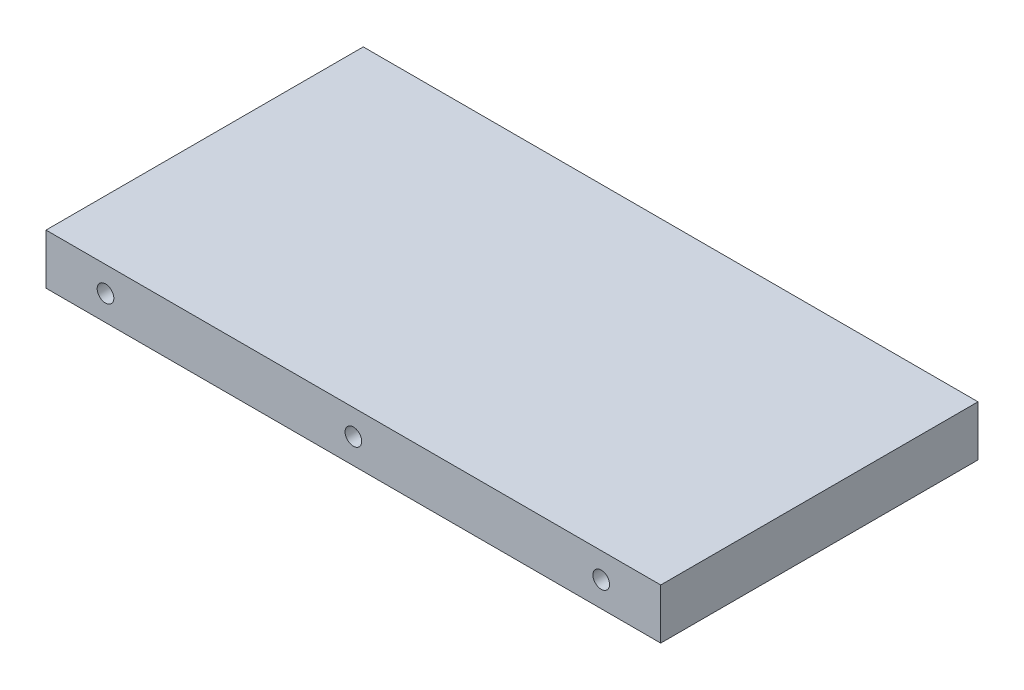
ISO-10303-21;
HEADER;
FILE_DESCRIPTION(('STEP AP214'),'2;1');
FILE_NAME('part.step','',(''),(''),'','','');
FILE_SCHEMA(('AUTOMOTIVE_DESIGN { 1 0 10303 214 1 1 1 1 }'));
ENDSEC;
DATA;
#1=APPLICATION_CONTEXT('core data for automotive mechanical design processes');
#2=APPLICATION_PROTOCOL_DEFINITION('international standard','automotive_design',2000,#1);
#3=PRODUCT_CONTEXT('',#1,'mechanical');
#4=PRODUCT('Part','Part','',(#3));
#5=PRODUCT_RELATED_PRODUCT_CATEGORY('part','',(#4));
#6=PRODUCT_DEFINITION_FORMATION('','',#4);
#7=PRODUCT_DEFINITION_CONTEXT('part definition',#1,'design');
#8=PRODUCT_DEFINITION('design','',#6,#7);
#9=PRODUCT_DEFINITION_SHAPE('','',#8);
#10=(LENGTH_UNIT() NAMED_UNIT(*) SI_UNIT(.MILLI.,.METRE.));
#11=(NAMED_UNIT(*) PLANE_ANGLE_UNIT() SI_UNIT($,.RADIAN.));
#12=(NAMED_UNIT(*) SI_UNIT($,.STERADIAN.) SOLID_ANGLE_UNIT());
#13=UNCERTAINTY_MEASURE_WITH_UNIT(LENGTH_MEASURE(1.E-05),#10,'distance_accuracy_value','');
#14=(GEOMETRIC_REPRESENTATION_CONTEXT(3) GLOBAL_UNCERTAINTY_ASSIGNED_CONTEXT((#13)) GLOBAL_UNIT_ASSIGNED_CONTEXT((#10,
#11,#12)) REPRESENTATION_CONTEXT('',''));
#15=CARTESIAN_POINT('',(0.,0.,0.));
#16=DIRECTION('',(0.,0.,1.));
#17=DIRECTION('',(1.,0.,0.));
#18=AXIS2_PLACEMENT_3D('',#15,#16,#17);
#19=CARTESIAN_POINT('',(-77.5,12.7,40.));
#20=DIRECTION('',(1.,0.,0.));
#21=DIRECTION('',(0.,0.,-1.));
#22=AXIS2_PLACEMENT_3D('',#19,#20,#21);
#23=PLANE('',#22);
#24=DIRECTION('',(0.,0.,1.));
#25=VECTOR('',#24,1.);
#26=CARTESIAN_POINT('',(-77.5,0.,40.));
#27=LINE('',#26,#25);
#28=CARTESIAN_POINT('',(-77.5,0.,-40.));
#29=VERTEX_POINT('',#28);
#30=CARTESIAN_POINT('',(-77.5,0.,40.));
#31=VERTEX_POINT('',#30);
#32=EDGE_CURVE('E97',#29,#31,#27,.T.);
#33=ORIENTED_EDGE('',*,*,#32,.T.);
#34=DIRECTION('',(0.,-1.,0.));
#35=VECTOR('',#34,1.);
#36=CARTESIAN_POINT('',(-77.5,12.7,40.));
#37=LINE('',#36,#35);
#38=CARTESIAN_POINT('',(-77.5,12.7,40.));
#39=VERTEX_POINT('',#38);
#40=EDGE_CURVE('E11',#39,#31,#37,.T.);
#41=ORIENTED_EDGE('',*,*,#40,.F.);
#42=DIRECTION('',(0.,0.,1.));
#43=VECTOR('',#42,1.);
#44=CARTESIAN_POINT('',(-77.5,12.7,40.));
#45=LINE('',#44,#43);
#46=CARTESIAN_POINT('',(-77.5,12.7,-40.));
#47=VERTEX_POINT('',#46);
#48=EDGE_CURVE('E85',#47,#39,#45,.T.);
#49=ORIENTED_EDGE('',*,*,#48,.F.);
#50=DIRECTION('',(0.,-1.,0.));
#51=VECTOR('',#50,1.);
#52=CARTESIAN_POINT('',(-77.5,12.7,-40.));
#53=LINE('',#52,#51);
#54=EDGE_CURVE('E93',#47,#29,#53,.T.);
#55=ORIENTED_EDGE('',*,*,#54,.T.);
#56=EDGE_LOOP('',(#33,#41,#49,#55));
#57=FACE_BOUND('',#56,.T.);
#58=ADVANCED_FACE('F34',(#57),#23,.F.);
#59=CARTESIAN_POINT('',(77.5,12.7,40.));
#60=DIRECTION('',(0.,0.,-1.));
#61=DIRECTION('',(-1.,0.,0.));
#62=AXIS2_PLACEMENT_3D('',#59,#60,#61);
#63=PLANE('',#62);
#64=CARTESIAN_POINT('',(-62.5,6.35,40.));
#65=DIRECTION('',(0.,0.,1.));
#66=DIRECTION('',(1.,0.,0.));
#67=AXIS2_PLACEMENT_3D('',#64,#65,#66);
#68=CIRCLE('',#67,2.1);
#69=CARTESIAN_POINT('',(-60.4,6.35,40.));
#70=VERTEX_POINT('',#69);
#71=EDGE_CURVE('E125',#70,#70,#68,.T.);
#72=ORIENTED_EDGE('',*,*,#71,.F.);
#73=EDGE_LOOP('',(#72));
#74=FACE_BOUND('',#73,.T.);
#75=CARTESIAN_POINT('',(0.,6.35,40.));
#76=DIRECTION('',(0.,0.,1.));
#77=DIRECTION('',(1.,0.,0.));
#78=AXIS2_PLACEMENT_3D('',#75,#76,#77);
#79=CIRCLE('',#78,2.1);
#80=CARTESIAN_POINT('',(2.1,6.35,40.));
#81=VERTEX_POINT('',#80);
#82=EDGE_CURVE('E119',#81,#81,#79,.T.);
#83=ORIENTED_EDGE('',*,*,#82,.F.);
#84=EDGE_LOOP('',(#83));
#85=FACE_BOUND('',#84,.T.);
#86=CARTESIAN_POINT('',(62.5,6.35000000000002,40.));
#87=DIRECTION('',(0.,0.,1.));
#88=DIRECTION('',(1.,0.,0.));
#89=AXIS2_PLACEMENT_3D('',#86,#87,#88);
#90=CIRCLE('',#89,2.1);
#91=CARTESIAN_POINT('',(64.6,6.35000000000002,40.));
#92=VERTEX_POINT('',#91);
#93=EDGE_CURVE('E113',#92,#92,#90,.T.);
#94=ORIENTED_EDGE('',*,*,#93,.F.);
#95=EDGE_LOOP('',(#94));
#96=FACE_BOUND('',#95,.T.);
#97=DIRECTION('',(1.,0.,0.));
#98=VECTOR('',#97,1.);
#99=CARTESIAN_POINT('',(77.5,0.,40.));
#100=LINE('',#99,#98);
#101=CARTESIAN_POINT('',(77.5,0.,40.));
#102=VERTEX_POINT('',#101);
#103=EDGE_CURVE('E89',#31,#102,#100,.T.);
#104=ORIENTED_EDGE('',*,*,#103,.T.);
#105=DIRECTION('',(0.,-1.,0.));
#106=VECTOR('',#105,1.);
#107=CARTESIAN_POINT('',(77.5,12.7,40.));
#108=LINE('',#107,#106);
#109=CARTESIAN_POINT('',(77.5,12.7,40.));
#110=VERTEX_POINT('',#109);
#111=EDGE_CURVE('E42',#110,#102,#108,.T.);
#112=ORIENTED_EDGE('',*,*,#111,.F.);
#113=DIRECTION('',(1.,0.,0.));
#114=VECTOR('',#113,1.);
#115=CARTESIAN_POINT('',(77.5,12.7,40.));
#116=LINE('',#115,#114);
#117=EDGE_CURVE('E80',#39,#110,#116,.T.);
#118=ORIENTED_EDGE('',*,*,#117,.F.);
#119=ORIENTED_EDGE('',*,*,#40,.T.);
#120=EDGE_LOOP('',(#104,#112,#118,#119));
#121=FACE_BOUND('',#120,.T.);
#122=ADVANCED_FACE('F88',(#74,#85,#96,#121),#63,.F.);
#123=CARTESIAN_POINT('',(77.5,12.7,40.));
#124=DIRECTION('',(-1.,0.,0.));
#125=DIRECTION('',(0.,0.,1.));
#126=AXIS2_PLACEMENT_3D('',#123,#124,#125);
#127=PLANE('',#126);
#128=DIRECTION('',(0.,0.,-1.));
#129=VECTOR('',#128,1.);
#130=CARTESIAN_POINT('',(77.5,0.,40.));
#131=LINE('',#130,#129);
#132=CARTESIAN_POINT('',(77.5,0.,-40.));
#133=VERTEX_POINT('',#132);
#134=EDGE_CURVE('E67',#102,#133,#131,.T.);
#135=ORIENTED_EDGE('',*,*,#134,.T.);
#136=DIRECTION('',(0.,-1.,0.));
#137=VECTOR('',#136,1.);
#138=CARTESIAN_POINT('',(77.5,12.7,-40.));
#139=LINE('',#138,#137);
#140=CARTESIAN_POINT('',(77.5,12.7,-40.));
#141=VERTEX_POINT('',#140);
#142=EDGE_CURVE('E90',#141,#133,#139,.T.);
#143=ORIENTED_EDGE('',*,*,#142,.F.);
#144=DIRECTION('',(0.,0.,-1.));
#145=VECTOR('',#144,1.);
#146=CARTESIAN_POINT('',(77.5,12.7,40.));
#147=LINE('',#146,#145);
#148=EDGE_CURVE('E83',#110,#141,#147,.T.);
#149=ORIENTED_EDGE('',*,*,#148,.F.);
#150=ORIENTED_EDGE('',*,*,#111,.T.);
#151=EDGE_LOOP('',(#135,#143,#149,#150));
#152=FACE_BOUND('',#151,.T.);
#153=ADVANCED_FACE('F91',(#152),#127,.F.);
#154=CARTESIAN_POINT('',(77.5,12.7,-40.));
#155=DIRECTION('',(0.,0.,1.));
#156=DIRECTION('',(1.,0.,0.));
#157=AXIS2_PLACEMENT_3D('',#154,#155,#156);
#158=PLANE('',#157);
#159=CARTESIAN_POINT('',(-62.5,6.35,-40.));
#160=DIRECTION('',(0.,0.,1.));
#161=DIRECTION('',(1.,0.,0.));
#162=AXIS2_PLACEMENT_3D('',#159,#160,#161);
#163=CIRCLE('',#162,2.09999999999999);
#164=CARTESIAN_POINT('',(-60.4,6.35,-40.));
#165=VERTEX_POINT('',#164);
#166=EDGE_CURVE('E122',#165,#165,#163,.T.);
#167=ORIENTED_EDGE('',*,*,#166,.T.);
#168=EDGE_LOOP('',(#167));
#169=FACE_BOUND('',#168,.T.);
#170=CARTESIAN_POINT('',(0.,6.35,-40.));
#171=DIRECTION('',(0.,0.,1.));
#172=DIRECTION('',(1.,0.,0.));
#173=AXIS2_PLACEMENT_3D('',#170,#171,#172);
#174=CIRCLE('',#173,2.09999999999999);
#175=CARTESIAN_POINT('',(2.09999999999999,6.35,-40.));
#176=VERTEX_POINT('',#175);
#177=EDGE_CURVE('E116',#176,#176,#174,.T.);
#178=ORIENTED_EDGE('',*,*,#177,.T.);
#179=EDGE_LOOP('',(#178));
#180=FACE_BOUND('',#179,.T.);
#181=CARTESIAN_POINT('',(62.5,6.35000000000002,-40.));
#182=DIRECTION('',(0.,0.,1.));
#183=DIRECTION('',(1.,0.,0.));
#184=AXIS2_PLACEMENT_3D('',#181,#182,#183);
#185=CIRCLE('',#184,2.09999999999999);
#186=CARTESIAN_POINT('',(64.6,6.35000000000002,-40.));
#187=VERTEX_POINT('',#186);
#188=EDGE_CURVE('E100',#187,#187,#185,.T.);
#189=ORIENTED_EDGE('',*,*,#188,.T.);
#190=EDGE_LOOP('',(#189));
#191=FACE_BOUND('',#190,.T.);
#192=DIRECTION('',(-1.,0.,0.));
#193=VECTOR('',#192,1.);
#194=CARTESIAN_POINT('',(77.5,0.,-40.));
#195=LINE('',#194,#193);
#196=EDGE_CURVE('E73',#133,#29,#195,.T.);
#197=ORIENTED_EDGE('',*,*,#196,.T.);
#198=ORIENTED_EDGE('',*,*,#54,.F.);
#199=DIRECTION('',(-1.,0.,0.));
#200=VECTOR('',#199,1.);
#201=CARTESIAN_POINT('',(77.5,12.7,-40.));
#202=LINE('',#201,#200);
#203=EDGE_CURVE('E50',#141,#47,#202,.T.);
#204=ORIENTED_EDGE('',*,*,#203,.F.);
#205=ORIENTED_EDGE('',*,*,#142,.T.);
#206=EDGE_LOOP('',(#197,#198,#204,#205));
#207=FACE_BOUND('',#206,.T.);
#208=ADVANCED_FACE('F105',(#169,#180,#191,#207),#158,.F.);
#209=CARTESIAN_POINT('',(0.,12.7,0.));
#210=DIRECTION('',(0.,1.,0.));
#211=DIRECTION('',(0.,0.,1.));
#212=AXIS2_PLACEMENT_3D('',#209,#210,#211);
#213=PLANE('',#212);
#214=ORIENTED_EDGE('',*,*,#48,.T.);
#215=ORIENTED_EDGE('',*,*,#117,.T.);
#216=ORIENTED_EDGE('',*,*,#148,.T.);
#217=ORIENTED_EDGE('',*,*,#203,.T.);
#218=EDGE_LOOP('',(#214,#215,#216,#217));
#219=FACE_BOUND('',#218,.T.);
#220=ADVANCED_FACE('F81',(#219),#213,.T.);
#221=CARTESIAN_POINT('',(0.,0.,0.));
#222=DIRECTION('',(0.,1.,0.));
#223=DIRECTION('',(0.,0.,1.));
#224=AXIS2_PLACEMENT_3D('',#221,#222,#223);
#225=PLANE('',#224);
#226=ORIENTED_EDGE('',*,*,#32,.F.);
#227=ORIENTED_EDGE('',*,*,#196,.F.);
#228=ORIENTED_EDGE('',*,*,#134,.F.);
#229=ORIENTED_EDGE('',*,*,#103,.F.);
#230=EDGE_LOOP('',(#226,#227,#228,#229));
#231=FACE_BOUND('',#230,.T.);
#232=ADVANCED_FACE('F108',(#231),#225,.F.);
#233=CARTESIAN_POINT('',(62.5,6.35000000000002,40.));
#234=DIRECTION('',(0.,0.,1.));
#235=DIRECTION('',(1.,0.,0.));
#236=AXIS2_PLACEMENT_3D('',#233,#234,#235);
#237=CYLINDRICAL_SURFACE('',#236,2.1);
#238=ORIENTED_EDGE('',*,*,#188,.F.);
#239=EDGE_LOOP('',(#238));
#240=FACE_BOUND('',#239,.T.);
#241=ORIENTED_EDGE('',*,*,#93,.T.);
#242=EDGE_LOOP('',(#241));
#243=FACE_BOUND('',#242,.T.);
#244=ADVANCED_FACE('F137',(#240,#243),#237,.F.);
#245=CARTESIAN_POINT('',(0.,6.35,40.));
#246=DIRECTION('',(0.,0.,1.));
#247=DIRECTION('',(1.,0.,0.));
#248=AXIS2_PLACEMENT_3D('',#245,#246,#247);
#249=CYLINDRICAL_SURFACE('',#248,2.09999999999999);
#250=ORIENTED_EDGE('',*,*,#177,.F.);
#251=EDGE_LOOP('',(#250));
#252=FACE_BOUND('',#251,.T.);
#253=ORIENTED_EDGE('',*,*,#82,.T.);
#254=EDGE_LOOP('',(#253));
#255=FACE_BOUND('',#254,.T.);
#256=ADVANCED_FACE('F139',(#252,#255),#249,.F.);
#257=CARTESIAN_POINT('',(-62.5,6.35,40.));
#258=DIRECTION('',(0.,0.,1.));
#259=DIRECTION('',(1.,0.,0.));
#260=AXIS2_PLACEMENT_3D('',#257,#258,#259);
#261=CYLINDRICAL_SURFACE('',#260,2.09999999999999);
#262=ORIENTED_EDGE('',*,*,#166,.F.);
#263=EDGE_LOOP('',(#262));
#264=FACE_BOUND('',#263,.T.);
#265=ORIENTED_EDGE('',*,*,#71,.T.);
#266=EDGE_LOOP('',(#265));
#267=FACE_BOUND('',#266,.T.);
#268=ADVANCED_FACE('F129',(#264,#267),#261,.F.);
#269=CLOSED_SHELL('',(#58,#122,#153,#208,#220,#232,#244,#256,#268));
#270=MANIFOLD_SOLID_BREP('B2',#269);
#271=ADVANCED_BREP_SHAPE_REPRESENTATION('',(#18,#270),#14);
#272=SHAPE_DEFINITION_REPRESENTATION(#9,#271);
ENDSEC;
END-ISO-10303-21;
